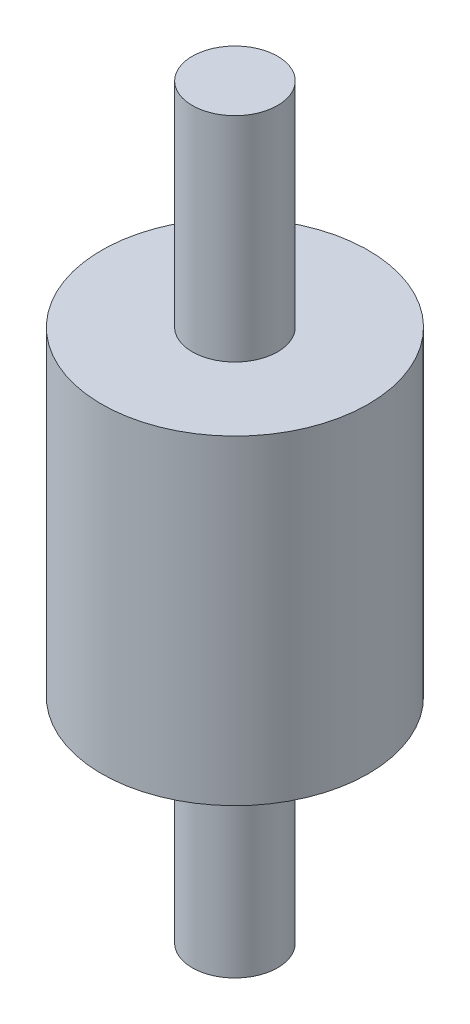
ISO-10303-21;
HEADER;
FILE_DESCRIPTION(('STEP AP214'),'2;1');
FILE_NAME('part.step','',(''),(''),'','','');
FILE_SCHEMA(('AUTOMOTIVE_DESIGN { 1 0 10303 214 1 1 1 1 }'));
ENDSEC;
DATA;
#1=APPLICATION_CONTEXT('core data for automotive mechanical design processes');
#2=APPLICATION_PROTOCOL_DEFINITION('international standard','automotive_design',2000,#1);
#3=PRODUCT_CONTEXT('',#1,'mechanical');
#4=PRODUCT('Part','Part','',(#3));
#5=PRODUCT_RELATED_PRODUCT_CATEGORY('part','',(#4));
#6=PRODUCT_DEFINITION_FORMATION('','',#4);
#7=PRODUCT_DEFINITION_CONTEXT('part definition',#1,'design');
#8=PRODUCT_DEFINITION('design','',#6,#7);
#9=PRODUCT_DEFINITION_SHAPE('','',#8);
#10=(LENGTH_UNIT() NAMED_UNIT(*) SI_UNIT(.MILLI.,.METRE.));
#11=(NAMED_UNIT(*) PLANE_ANGLE_UNIT() SI_UNIT($,.RADIAN.));
#12=(NAMED_UNIT(*) SI_UNIT($,.STERADIAN.) SOLID_ANGLE_UNIT());
#13=UNCERTAINTY_MEASURE_WITH_UNIT(LENGTH_MEASURE(1.E-05),#10,'distance_accuracy_value','');
#14=(GEOMETRIC_REPRESENTATION_CONTEXT(3) GLOBAL_UNCERTAINTY_ASSIGNED_CONTEXT((#13)) GLOBAL_UNIT_ASSIGNED_CONTEXT((#10,
#11,#12)) REPRESENTATION_CONTEXT('',''));
#15=CARTESIAN_POINT('',(0.,0.,0.));
#16=DIRECTION('',(0.,0.,1.));
#17=DIRECTION('',(1.,0.,0.));
#18=AXIS2_PLACEMENT_3D('',#15,#16,#17);
#19=CARTESIAN_POINT('',(0.,70.,0.));
#20=DIRECTION('',(0.,-1.,0.));
#21=DIRECTION('',(1.,0.,0.));
#22=AXIS2_PLACEMENT_3D('',#19,#20,#21);
#23=PLANE('',#22);
#24=CARTESIAN_POINT('',(0.,70.,0.));
#25=DIRECTION('',(0.,-1.,0.));
#26=DIRECTION('',(1.,0.,0.));
#27=AXIS2_PLACEMENT_3D('',#24,#25,#26);
#28=CIRCLE('',#27,4.);
#29=CARTESIAN_POINT('',(4.00000000000001,70.,0.));
#30=VERTEX_POINT('',#29);
#31=EDGE_CURVE('E10',#30,#30,#28,.T.);
#32=ORIENTED_EDGE('',*,*,#31,.F.);
#33=EDGE_LOOP('',(#32));
#34=FACE_BOUND('',#33,.T.);
#35=ADVANCED_FACE('F32',(#34),#23,.F.);
#36=CARTESIAN_POINT('',(0.,0.,0.));
#37=DIRECTION('',(0.,-1.,0.));
#38=DIRECTION('',(1.,0.,0.));
#39=AXIS2_PLACEMENT_3D('',#36,#37,#38);
#40=CYLINDRICAL_SURFACE('',#39,4.);
#41=CARTESIAN_POINT('',(0.,50.,0.));
#42=DIRECTION('',(0.,-1.,0.));
#43=DIRECTION('',(1.,0.,0.));
#44=AXIS2_PLACEMENT_3D('',#41,#42,#43);
#45=CIRCLE('',#44,4.);
#46=CARTESIAN_POINT('',(4.,50.,0.));
#47=VERTEX_POINT('',#46);
#48=EDGE_CURVE('E38',#47,#47,#45,.T.);
#49=ORIENTED_EDGE('',*,*,#48,.F.);
#50=EDGE_LOOP('',(#49));
#51=FACE_BOUND('',#50,.T.);
#52=ORIENTED_EDGE('',*,*,#31,.T.);
#53=EDGE_LOOP('',(#52));
#54=FACE_BOUND('',#53,.T.);
#55=ADVANCED_FACE('F80',(#51,#54),#40,.T.);
#56=CARTESIAN_POINT('',(-3.99999999999999,50.,0.));
#57=DIRECTION('',(0.,-1.,0.));
#58=DIRECTION('',(1.,0.,0.));
#59=AXIS2_PLACEMENT_3D('',#56,#57,#58);
#60=PLANE('',#59);
#61=CARTESIAN_POINT('',(0.,50.,0.));
#62=DIRECTION('',(0.,-1.,0.));
#63=DIRECTION('',(1.,0.,0.));
#64=AXIS2_PLACEMENT_3D('',#61,#62,#63);
#65=CIRCLE('',#64,12.5);
#66=CARTESIAN_POINT('',(12.5,50.,0.));
#67=VERTEX_POINT('',#66);
#68=EDGE_CURVE('E42',#67,#67,#65,.T.);
#69=ORIENTED_EDGE('',*,*,#68,.F.);
#70=EDGE_LOOP('',(#69));
#71=FACE_BOUND('',#70,.T.);
#72=ORIENTED_EDGE('',*,*,#48,.T.);
#73=EDGE_LOOP('',(#72));
#74=FACE_BOUND('',#73,.T.);
#75=ADVANCED_FACE('F75',(#71,#74),#60,.F.);
#76=CARTESIAN_POINT('',(0.,0.,0.));
#77=DIRECTION('',(0.,-1.,0.));
#78=DIRECTION('',(1.,0.,0.));
#79=AXIS2_PLACEMENT_3D('',#76,#77,#78);
#80=CYLINDRICAL_SURFACE('',#79,12.5);
#81=CARTESIAN_POINT('',(0.,20.,0.));
#82=DIRECTION('',(0.,-1.,0.));
#83=DIRECTION('',(1.,0.,0.));
#84=AXIS2_PLACEMENT_3D('',#81,#82,#83);
#85=CIRCLE('',#84,12.5);
#86=CARTESIAN_POINT('',(12.5,20.,0.));
#87=VERTEX_POINT('',#86);
#88=EDGE_CURVE('E46',#87,#87,#85,.T.);
#89=ORIENTED_EDGE('',*,*,#88,.F.);
#90=EDGE_LOOP('',(#89));
#91=FACE_BOUND('',#90,.T.);
#92=ORIENTED_EDGE('',*,*,#68,.T.);
#93=EDGE_LOOP('',(#92));
#94=FACE_BOUND('',#93,.T.);
#95=ADVANCED_FACE('F69',(#91,#94),#80,.T.);
#96=CARTESIAN_POINT('',(-12.5,20.,0.));
#97=DIRECTION('',(0.,1.,0.));
#98=DIRECTION('',(-1.,0.,0.));
#99=AXIS2_PLACEMENT_3D('',#96,#97,#98);
#100=PLANE('',#99);
#101=CARTESIAN_POINT('',(0.,20.,0.));
#102=DIRECTION('',(0.,-1.,0.));
#103=DIRECTION('',(1.,0.,0.));
#104=AXIS2_PLACEMENT_3D('',#101,#102,#103);
#105=CIRCLE('',#104,3.99999999999999);
#106=CARTESIAN_POINT('',(3.99999999999999,20.,0.));
#107=VERTEX_POINT('',#106);
#108=EDGE_CURVE('E51',#107,#107,#105,.T.);
#109=ORIENTED_EDGE('',*,*,#108,.F.);
#110=EDGE_LOOP('',(#109));
#111=FACE_BOUND('',#110,.T.);
#112=ORIENTED_EDGE('',*,*,#88,.T.);
#113=EDGE_LOOP('',(#112));
#114=FACE_BOUND('',#113,.T.);
#115=ADVANCED_FACE('F63',(#111,#114),#100,.F.);
#116=CARTESIAN_POINT('',(0.,0.,0.));
#117=DIRECTION('',(0.,-1.,0.));
#118=DIRECTION('',(1.,0.,0.));
#119=AXIS2_PLACEMENT_3D('',#116,#117,#118);
#120=CYLINDRICAL_SURFACE('',#119,3.99999999999999);
#121=CARTESIAN_POINT('',(0.,0.,0.));
#122=DIRECTION('',(0.,-1.,0.));
#123=DIRECTION('',(1.,0.,0.));
#124=AXIS2_PLACEMENT_3D('',#121,#122,#123);
#125=CIRCLE('',#124,4.);
#126=CARTESIAN_POINT('',(4.,0.,0.));
#127=VERTEX_POINT('',#126);
#128=EDGE_CURVE('E54',#127,#127,#125,.T.);
#129=ORIENTED_EDGE('',*,*,#128,.F.);
#130=EDGE_LOOP('',(#129));
#131=FACE_BOUND('',#130,.T.);
#132=ORIENTED_EDGE('',*,*,#108,.T.);
#133=EDGE_LOOP('',(#132));
#134=FACE_BOUND('',#133,.T.);
#135=ADVANCED_FACE('F60',(#131,#134),#120,.T.);
#136=CARTESIAN_POINT('',(-4.,0.,0.));
#137=DIRECTION('',(0.,1.,0.));
#138=DIRECTION('',(-1.,0.,0.));
#139=AXIS2_PLACEMENT_3D('',#136,#137,#138);
#140=PLANE('',#139);
#141=ORIENTED_EDGE('',*,*,#128,.T.);
#142=EDGE_LOOP('',(#141));
#143=FACE_BOUND('',#142,.T.);
#144=ADVANCED_FACE('F58',(#143),#140,.F.);
#145=CLOSED_SHELL('',(#35,#55,#75,#95,#115,#135,#144));
#146=MANIFOLD_SOLID_BREP('B2',#145);
#147=ADVANCED_BREP_SHAPE_REPRESENTATION('',(#18,#146),#14);
#148=SHAPE_DEFINITION_REPRESENTATION(#9,#147);
ENDSEC;
END-ISO-10303-21;
